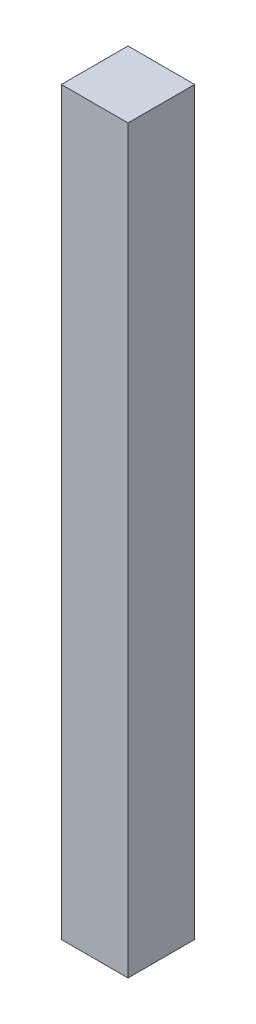
ISO-10303-21;
HEADER;
FILE_DESCRIPTION(('STEP AP214'),'2;1');
FILE_NAME('part.step','',(''),(''),'','','');
FILE_SCHEMA(('AUTOMOTIVE_DESIGN { 1 0 10303 214 1 1 1 1 }'));
ENDSEC;
DATA;
#1=APPLICATION_CONTEXT('core data for automotive mechanical design processes');
#2=APPLICATION_PROTOCOL_DEFINITION('international standard','automotive_design',2000,#1);
#3=PRODUCT_CONTEXT('',#1,'mechanical');
#4=PRODUCT('Part','Part','',(#3));
#5=PRODUCT_RELATED_PRODUCT_CATEGORY('part','',(#4));
#6=PRODUCT_DEFINITION_FORMATION('','',#4);
#7=PRODUCT_DEFINITION_CONTEXT('part definition',#1,'design');
#8=PRODUCT_DEFINITION('design','',#6,#7);
#9=PRODUCT_DEFINITION_SHAPE('','',#8);
#10=(LENGTH_UNIT() NAMED_UNIT(*) SI_UNIT(.MILLI.,.METRE.));
#11=(NAMED_UNIT(*) PLANE_ANGLE_UNIT() SI_UNIT($,.RADIAN.));
#12=(NAMED_UNIT(*) SI_UNIT($,.STERADIAN.) SOLID_ANGLE_UNIT());
#13=UNCERTAINTY_MEASURE_WITH_UNIT(LENGTH_MEASURE(1.E-05),#10,'distance_accuracy_value','');
#14=(GEOMETRIC_REPRESENTATION_CONTEXT(3) GLOBAL_UNCERTAINTY_ASSIGNED_CONTEXT((#13)) GLOBAL_UNIT_ASSIGNED_CONTEXT((#10,
#11,#12)) REPRESENTATION_CONTEXT('',''));
#15=CARTESIAN_POINT('',(0.,0.,0.));
#16=DIRECTION('',(0.,0.,1.));
#17=DIRECTION('',(1.,0.,0.));
#18=AXIS2_PLACEMENT_3D('',#15,#16,#17);
#19=CARTESIAN_POINT('',(45.,1180.,26.));
#20=DIRECTION('',(1.,0.,0.));
#21=DIRECTION('',(0.,0.,-1.));
#22=AXIS2_PLACEMENT_3D('',#19,#20,#21);
#23=PLANE('',#22);
#24=DIRECTION('',(0.,-1.,0.));
#25=VECTOR('',#24,1.);
#26=CARTESIAN_POINT('',(45.,1180.,8.));
#27=LINE('',#26,#25);
#28=CARTESIAN_POINT('',(45.,1380.,8.));
#29=VERTEX_POINT('',#28);
#30=CARTESIAN_POINT('',(45.,1180.,8.));
#31=VERTEX_POINT('',#30);
#32=EDGE_CURVE('E102',#29,#31,#27,.T.);
#33=ORIENTED_EDGE('',*,*,#32,.T.);
#34=DIRECTION('',(0.,0.,-1.));
#35=VECTOR('',#34,1.);
#36=CARTESIAN_POINT('',(45.,1180.,26.));
#37=LINE('',#36,#35);
#38=CARTESIAN_POINT('',(45.,1180.,26.));
#39=VERTEX_POINT('',#38);
#40=EDGE_CURVE('E11',#39,#31,#37,.T.);
#41=ORIENTED_EDGE('',*,*,#40,.F.);
#42=DIRECTION('',(0.,-1.,0.));
#43=VECTOR('',#42,1.);
#44=CARTESIAN_POINT('',(45.,1180.,26.));
#45=LINE('',#44,#43);
#46=CARTESIAN_POINT('',(45.,1380.,26.));
#47=VERTEX_POINT('',#46);
#48=EDGE_CURVE('E90',#47,#39,#45,.T.);
#49=ORIENTED_EDGE('',*,*,#48,.F.);
#50=DIRECTION('',(0.,0.,-1.));
#51=VECTOR('',#50,1.);
#52=CARTESIAN_POINT('',(45.,1380.,26.));
#53=LINE('',#52,#51);
#54=EDGE_CURVE('E98',#47,#29,#53,.T.);
#55=ORIENTED_EDGE('',*,*,#54,.T.);
#56=EDGE_LOOP('',(#33,#41,#49,#55));
#57=FACE_BOUND('',#56,.T.);
#58=ADVANCED_FACE('F39',(#57),#23,.F.);
#59=CARTESIAN_POINT('',(45.,1180.,26.));
#60=DIRECTION('',(0.,1.,0.));
#61=DIRECTION('',(0.,0.,1.));
#62=AXIS2_PLACEMENT_3D('',#59,#60,#61);
#63=PLANE('',#62);
#64=DIRECTION('',(1.,0.,0.));
#65=VECTOR('',#64,1.);
#66=CARTESIAN_POINT('',(45.,1180.,8.));
#67=LINE('',#66,#65);
#68=CARTESIAN_POINT('',(63.,1180.,8.));
#69=VERTEX_POINT('',#68);
#70=EDGE_CURVE('E94',#31,#69,#67,.T.);
#71=ORIENTED_EDGE('',*,*,#70,.T.);
#72=DIRECTION('',(0.,0.,-1.));
#73=VECTOR('',#72,1.);
#74=CARTESIAN_POINT('',(63.,1180.,26.));
#75=LINE('',#74,#73);
#76=CARTESIAN_POINT('',(63.,1180.,26.));
#77=VERTEX_POINT('',#76);
#78=EDGE_CURVE('E47',#77,#69,#75,.T.);
#79=ORIENTED_EDGE('',*,*,#78,.F.);
#80=DIRECTION('',(1.,0.,0.));
#81=VECTOR('',#80,1.);
#82=CARTESIAN_POINT('',(45.,1180.,26.));
#83=LINE('',#82,#81);
#84=EDGE_CURVE('E85',#39,#77,#83,.T.);
#85=ORIENTED_EDGE('',*,*,#84,.F.);
#86=ORIENTED_EDGE('',*,*,#40,.T.);
#87=EDGE_LOOP('',(#71,#79,#85,#86));
#88=FACE_BOUND('',#87,.T.);
#89=ADVANCED_FACE('F93',(#88),#63,.F.);
#90=CARTESIAN_POINT('',(63.,1180.,26.));
#91=DIRECTION('',(-1.,0.,0.));
#92=DIRECTION('',(0.,0.,1.));
#93=AXIS2_PLACEMENT_3D('',#90,#91,#92);
#94=PLANE('',#93);
#95=DIRECTION('',(0.,1.,0.));
#96=VECTOR('',#95,1.);
#97=CARTESIAN_POINT('',(63.,1180.,8.));
#98=LINE('',#97,#96);
#99=CARTESIAN_POINT('',(63.,1380.,8.));
#100=VERTEX_POINT('',#99);
#101=EDGE_CURVE('E72',#69,#100,#98,.T.);
#102=ORIENTED_EDGE('',*,*,#101,.T.);
#103=DIRECTION('',(0.,0.,-1.));
#104=VECTOR('',#103,1.);
#105=CARTESIAN_POINT('',(63.,1380.,26.));
#106=LINE('',#105,#104);
#107=CARTESIAN_POINT('',(63.,1380.,26.));
#108=VERTEX_POINT('',#107);
#109=EDGE_CURVE('E95',#108,#100,#106,.T.);
#110=ORIENTED_EDGE('',*,*,#109,.F.);
#111=DIRECTION('',(0.,1.,0.));
#112=VECTOR('',#111,1.);
#113=CARTESIAN_POINT('',(63.,1180.,26.));
#114=LINE('',#113,#112);
#115=EDGE_CURVE('E88',#77,#108,#114,.T.);
#116=ORIENTED_EDGE('',*,*,#115,.F.);
#117=ORIENTED_EDGE('',*,*,#78,.T.);
#118=EDGE_LOOP('',(#102,#110,#116,#117));
#119=FACE_BOUND('',#118,.T.);
#120=ADVANCED_FACE('F96',(#119),#94,.F.);
#121=CARTESIAN_POINT('',(45.,1380.,26.));
#122=DIRECTION('',(0.,-1.,0.));
#123=DIRECTION('',(0.,0.,-1.));
#124=AXIS2_PLACEMENT_3D('',#121,#122,#123);
#125=PLANE('',#124);
#126=DIRECTION('',(-1.,0.,0.));
#127=VECTOR('',#126,1.);
#128=CARTESIAN_POINT('',(45.,1380.,8.));
#129=LINE('',#128,#127);
#130=EDGE_CURVE('E78',#100,#29,#129,.T.);
#131=ORIENTED_EDGE('',*,*,#130,.T.);
#132=ORIENTED_EDGE('',*,*,#54,.F.);
#133=DIRECTION('',(-1.,0.,0.));
#134=VECTOR('',#133,1.);
#135=CARTESIAN_POINT('',(45.,1380.,26.));
#136=LINE('',#135,#134);
#137=EDGE_CURVE('E55',#108,#47,#136,.T.);
#138=ORIENTED_EDGE('',*,*,#137,.F.);
#139=ORIENTED_EDGE('',*,*,#109,.T.);
#140=EDGE_LOOP('',(#131,#132,#138,#139));
#141=FACE_BOUND('',#140,.T.);
#142=ADVANCED_FACE('F109',(#141),#125,.F.);
#143=CARTESIAN_POINT('',(0.,0.,26.));
#144=DIRECTION('',(0.,0.,-1.));
#145=DIRECTION('',(-1.,0.,0.));
#146=AXIS2_PLACEMENT_3D('',#143,#144,#145);
#147=PLANE('',#146);
#148=ORIENTED_EDGE('',*,*,#48,.T.);
#149=ORIENTED_EDGE('',*,*,#84,.T.);
#150=ORIENTED_EDGE('',*,*,#115,.T.);
#151=ORIENTED_EDGE('',*,*,#137,.T.);
#152=EDGE_LOOP('',(#148,#149,#150,#151));
#153=FACE_BOUND('',#152,.T.);
#154=ADVANCED_FACE('F86',(#153),#147,.F.);
#155=CARTESIAN_POINT('',(0.,0.,8.));
#156=DIRECTION('',(0.,0.,-1.));
#157=DIRECTION('',(-1.,0.,0.));
#158=AXIS2_PLACEMENT_3D('',#155,#156,#157);
#159=PLANE('',#158);
#160=ORIENTED_EDGE('',*,*,#32,.F.);
#161=ORIENTED_EDGE('',*,*,#130,.F.);
#162=ORIENTED_EDGE('',*,*,#101,.F.);
#163=ORIENTED_EDGE('',*,*,#70,.F.);
#164=EDGE_LOOP('',(#160,#161,#162,#163));
#165=FACE_BOUND('',#164,.T.);
#166=ADVANCED_FACE('F112',(#165),#159,.T.);
#167=CLOSED_SHELL('',(#58,#89,#120,#142,#154,#166));
#168=MANIFOLD_SOLID_BREP('B2',#167);
#169=ADVANCED_BREP_SHAPE_REPRESENTATION('',(#18,#168),#14);
#170=SHAPE_DEFINITION_REPRESENTATION(#9,#169);
ENDSEC;
END-ISO-10303-21;
